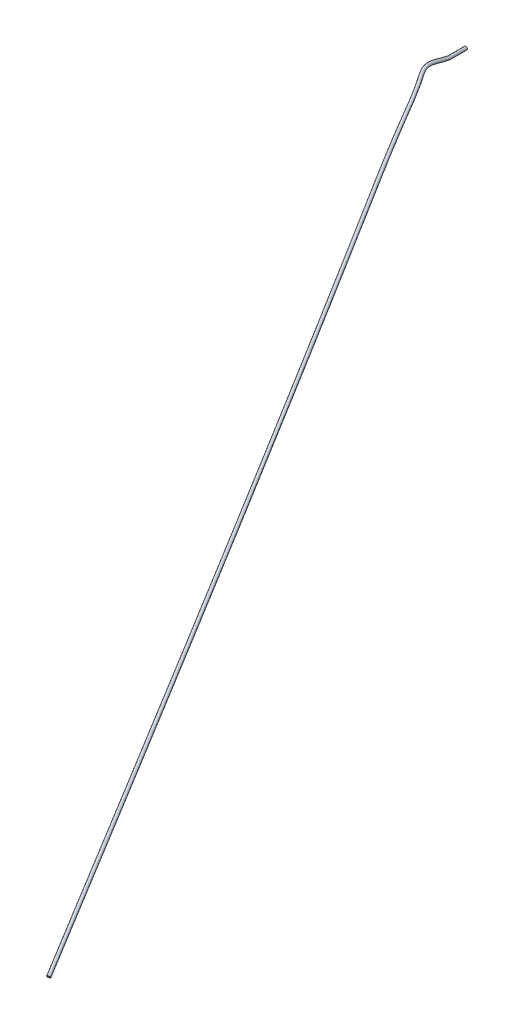
ISO-10303-21;
HEADER;
FILE_DESCRIPTION(('STEP AP214'),'2;1');
FILE_NAME('part.step','',(''),(''),'','','');
FILE_SCHEMA(('AUTOMOTIVE_DESIGN { 1 0 10303 214 1 1 1 1 }'));
ENDSEC;
DATA;
#1=APPLICATION_CONTEXT('core data for automotive mechanical design processes');
#2=APPLICATION_PROTOCOL_DEFINITION('international standard','automotive_design',2000,#1);
#3=PRODUCT_CONTEXT('',#1,'mechanical');
#4=PRODUCT('Part','Part','',(#3));
#5=PRODUCT_RELATED_PRODUCT_CATEGORY('part','',(#4));
#6=PRODUCT_DEFINITION_FORMATION('','',#4);
#7=PRODUCT_DEFINITION_CONTEXT('part definition',#1,'design');
#8=PRODUCT_DEFINITION('design','',#6,#7);
#9=PRODUCT_DEFINITION_SHAPE('','',#8);
#10=(LENGTH_UNIT() NAMED_UNIT(*) SI_UNIT(.MILLI.,.METRE.));
#11=(NAMED_UNIT(*) PLANE_ANGLE_UNIT() SI_UNIT($,.RADIAN.));
#12=(NAMED_UNIT(*) SI_UNIT($,.STERADIAN.) SOLID_ANGLE_UNIT());
#13=UNCERTAINTY_MEASURE_WITH_UNIT(LENGTH_MEASURE(1.E-05),#10,'distance_accuracy_value','');
#14=(GEOMETRIC_REPRESENTATION_CONTEXT(3) GLOBAL_UNCERTAINTY_ASSIGNED_CONTEXT((#13)) GLOBAL_UNIT_ASSIGNED_CONTEXT((#10,
#11,#12)) REPRESENTATION_CONTEXT('',''));
#15=CARTESIAN_POINT('',(0.,0.,0.));
#16=DIRECTION('',(0.,0.,1.));
#17=DIRECTION('',(1.,0.,0.));
#18=AXIS2_PLACEMENT_3D('',#15,#16,#17);
#19=CARTESIAN_POINT('',(236.710605485788,-352.252507170124,632.934798983279));
#20=DIRECTION('',(0.322690557369012,-0.480200528574051,0.815645913704028));
#21=DIRECTION('',(0.942648952073105,0.0853449315447556,-0.322690557368973));
#22=AXIS2_PLACEMENT_3D('',#19,#20,#21);
#23=PLANE('',#22);
#24=CARTESIAN_POINT('',(236.710605485788,-352.252507170124,632.934798983279));
#25=DIRECTION('',(0.322690557369012,-0.480200528574051,0.815645913704028));
#26=DIRECTION('',(0.942648952073105,0.0853449315447556,-0.322690557368973));
#27=AXIS2_PLACEMENT_3D('',#24,#25,#26);
#28=CIRCLE('',#27,0.79375);
#29=CARTESIAN_POINT('',(237.458833091496,-352.184764630711,632.678663353367));
#30=VERTEX_POINT('',#29);
#31=EDGE_CURVE('E86',#30,#30,#28,.T.);
#32=ORIENTED_EDGE('',*,*,#31,.F.);
#33=EDGE_LOOP('',(#32));
#34=FACE_BOUND('',#33,.T.);
#35=CARTESIAN_POINT('',(236.710605485788,-352.252507170124,632.934798983279));
#36=DIRECTION('',(0.322690557369012,-0.480200528574051,0.815645913704028));
#37=DIRECTION('',(0.942648952073105,0.0853449315447556,-0.322690557368973));
#38=AXIS2_PLACEMENT_3D('',#35,#36,#37);
#39=CIRCLE('',#38,1.5875);
#40=CARTESIAN_POINT('',(238.207060697204,-352.117022091297,632.422527723456));
#41=VERTEX_POINT('',#40);
#42=EDGE_CURVE('E76',#41,#41,#39,.T.);
#43=ORIENTED_EDGE('',*,*,#42,.T.);
#44=EDGE_LOOP('',(#43));
#45=FACE_BOUND('',#44,.T.);
#46=ADVANCED_FACE('F73',(#34,#45),#23,.T.);
#47=CARTESIAN_POINT('',(0.,0.,-16.002));
#48=DIRECTION('',(0.,0.,1.));
#49=DIRECTION('',(1.,0.,0.));
#50=AXIS2_PLACEMENT_3D('',#47,#48,#49);
#51=PLANE('',#50);
#52=CARTESIAN_POINT('',(0.,0.,-16.002));
#53=DIRECTION('',(0.,0.,1.));
#54=DIRECTION('',(1.,0.,0.));
#55=AXIS2_PLACEMENT_3D('',#52,#53,#54);
#56=CIRCLE('',#55,0.79375);
#57=CARTESIAN_POINT('',(0.793749999999997,0.,-16.002));
#58=VERTEX_POINT('',#57);
#59=EDGE_CURVE('E80',#58,#58,#56,.T.);
#60=ORIENTED_EDGE('',*,*,#59,.T.);
#61=EDGE_LOOP('',(#60));
#62=FACE_BOUND('',#61,.T.);
#63=CARTESIAN_POINT('',(0.,0.,-16.002));
#64=DIRECTION('',(0.,0.,1.));
#65=DIRECTION('',(1.,0.,0.));
#66=AXIS2_PLACEMENT_3D('',#63,#64,#65);
#67=CIRCLE('',#66,1.5875);
#68=CARTESIAN_POINT('',(1.5875,0.,-16.002));
#69=VERTEX_POINT('',#68);
#70=EDGE_CURVE('E11',#69,#69,#67,.T.);
#71=ORIENTED_EDGE('',*,*,#70,.F.);
#72=EDGE_LOOP('',(#71));
#73=FACE_BOUND('',#72,.T.);
#74=ADVANCED_FACE('F97',(#62,#73),#51,.F.);
#75=CARTESIAN_POINT('',(1.5875,0.,-16.002));
#76=CARTESIAN_POINT('',(1.56231812984331,0.0374735085473378,-12.8117191256881));
#77=CARTESIAN_POINT('',(1.51953913729642,0.101133551779921,-7.39206598255584));
#78=CARTESIAN_POINT('',(1.7526528527478,-0.245766370827986,0.762523901290285));
#79=CARTESIAN_POINT('',(0.7868840989971,1.19140820847362,8.16614427153038));
#80=CARTESIAN_POINT('',(-0.103520265767398,2.51643194046857,15.2297698194791));
#81=CARTESIAN_POINT('',(-0.198002301530254,2.6570320369944,20.0663155760043));
#82=CARTESIAN_POINT('',(0.30707598409501,1.90541766777946,23.4675066524053));
#83=CARTESIAN_POINT('',(1.27759821181992,0.4611693744728,26.4628435951212));
#84=CARTESIAN_POINT('',(2.39790059736375,-1.2059689579505,28.8211496680421));
#85=CARTESIAN_POINT('',(7.34937500872136,-8.57433030369576,39.7303726570623));
#86=CARTESIAN_POINT('',(12.1784478012152,-15.7605440137744,53.5722896940292));
#87=CARTESIAN_POINT('',(22.5705848640703,-31.225234865854,81.2106490986659));
#88=CARTESIAN_POINT('',(34.8543934038217,-49.5049496544887,111.68617938742));
#89=CARTESIAN_POINT('',(66.7963432599243,-97.038231476076,191.560996686692));
#90=CARTESIAN_POINT('',(135.043378662255,-198.597641026243,364.461788076484));
#91=CARTESIAN_POINT('',(196.941587883224,-290.709269665275,525.238231864667));
#92=CARTESIAN_POINT('',(238.207060697204,-352.117022091297,632.422527723456));
#93=CARTESIAN_POINT('',(1.5875,-3.175,-16.002));
#94=CARTESIAN_POINT('',(1.55382256036675,-3.1248841105091,-12.6842861334181));
#95=CARTESIAN_POINT('',(1.49661128375764,-3.03974717470284,-7.04814966348664));
#96=CARTESIAN_POINT('',(1.7159823889855,-3.36619651844317,1.32760001656434));
#97=CARTESIAN_POINT('',(0.749862311107635,-1.9284991285796,8.77027428200376));
#98=CARTESIAN_POINT('',(-0.124143175327823,-0.627878806791702,15.6511238676273));
#99=CARTESIAN_POINT('',(-0.157254558283172,-0.57860527450566,19.8417954405262));
#100=CARTESIAN_POINT('',(0.171161116927951,-1.06732543450726,22.4135510949093));
#101=CARTESIAN_POINT('',(0.969801414369941,-2.25579371848502,24.7837402976175));
#102=CARTESIAN_POINT('',(2.06475402003297,-3.88520867344959,27.1161572417102));
#103=CARTESIAN_POINT('',(6.96422987808324,-11.1761902130213,38.1151447714558));
#104=CARTESIAN_POINT('',(11.8393909503819,-18.4309885650052,52.022989555991));
#105=CARTESIAN_POINT('',(22.3523593910244,-34.0754903540856,79.7216622773144));
#106=CARTESIAN_POINT('',(34.6428438743869,-52.3651397118533,110.184794100101));
#107=CARTESIAN_POINT('',(66.4186820437248,-99.6512283077165,189.925176063826));
#108=CARTESIAN_POINT('',(134.844251297124,-201.476316687628,362.993776591847));
#109=CARTESIAN_POINT('',(196.699354842579,-293.523799141737,523.736245263879));
#110=CARTESIAN_POINT('',(237.93609053955,-354.888787444475,630.897891045233));
#111=CARTESIAN_POINT('',(-1.5875,-3.175,-16.002));
#112=CARTESIAN_POINT('',(-1.6154684912119,-3.13337967998552,-12.7699199902257));
#113=CARTESIAN_POINT('',(-1.66298139909588,-3.06267502824125,-7.27925842344221));
#114=CARTESIAN_POINT('',(-1.43437537993345,-3.40286698220501,0.947873806901065));
#115=CARTESIAN_POINT('',(-2.40025937106898,-1.96552091646891,8.36430419616919));
#116=CARTESIAN_POINT('',(-3.28528476038501,-0.648501716352828,15.3679776306784));
#117=CARTESIAN_POINT('',(-3.35963668553506,-0.537857531259143,19.9926710088499));
#118=CARTESIAN_POINT('',(-2.91250528048067,-1.20324030167485,23.1218000160432));
#119=CARTESIAN_POINT('',(-1.99836182845167,-2.56359051593552,25.9120830350994));
#120=CARTESIAN_POINT('',(-0.886374392312285,-4.21835525078089,28.2618972474462));
#121=CARTESIAN_POINT('',(4.04804403899785,-11.5613353436599,39.200563790531));
#122=CARTESIAN_POINT('',(8.89223419016368,-18.7700454158389,53.0641057050296));
#123=CARTESIAN_POINT('',(19.3240050012208,-34.293715827132,80.7222484047886));
#124=CARTESIAN_POINT('',(31.6100033088366,-52.5766892412887,111.19371188832));
#125=CARTESIAN_POINT('',(63.4974670795598,-100.028889523916,191.024433222321));
#126=CARTESIAN_POINT('',(131.803063145754,-201.67544405276,363.980267476412));
#127=CARTESIAN_POINT('',(193.687133328332,-293.766032182382,524.745567129493));
#128=CARTESIAN_POINT('',(234.943180116718,-355.15975760213,631.922433564879));
#129=CARTESIAN_POINT('',(-1.5875,0.,-16.002));
#130=CARTESIAN_POINT('',(-1.60697292173534,0.028977939070915,-12.8973529824957));
#131=CARTESIAN_POINT('',(-1.6400535455571,0.0782056982415111,-7.62317474251141));
#132=CARTESIAN_POINT('',(-1.39770491617115,-0.282436834589828,0.382797691627002));
#133=CARTESIAN_POINT('',(-2.36323758317951,1.15438642058431,7.76017418569581));
#134=CARTESIAN_POINT('',(-3.26466185082459,2.49580903090744,14.9466235825302));
#135=CARTESIAN_POINT('',(-3.40038442878214,2.69777978024092,20.2171911443281));
#136=CARTESIAN_POINT('',(-2.77659041331361,1.76950280061187,24.1757555735392));
#137=CARTESIAN_POINT('',(-1.69056503100169,0.153372577022304,27.5911863326032));
#138=CARTESIAN_POINT('',(-0.553227814981497,-1.53911553528179,29.9668896737781));
#139=CARTESIAN_POINT('',(4.43318916963597,-8.95947543433436,40.8157916761375));
#140=CARTESIAN_POINT('',(9.23129104099691,-16.0996008646081,54.6134058430677));
#141=CARTESIAN_POINT('',(19.5422304742666,-31.4434603389004,82.2112352261401));
#142=CARTESIAN_POINT('',(31.8215528382715,-49.7164991839241,112.69509717564));
#143=CARTESIAN_POINT('',(63.8751282957593,-97.415892692276,192.660253845187));
#144=CARTESIAN_POINT('',(132.002190510885,-198.796768391374,365.448278961049));
#145=CARTESIAN_POINT('',(193.929366368977,-290.951502705921,526.247553730281));
#146=CARTESIAN_POINT('',(235.214150274372,-352.387992248952,633.447070243102));
#147=CARTESIAN_POINT('',(-1.5875,3.175,-16.002));
#148=CARTESIAN_POINT('',(-1.59847735225877,3.19133555812735,-13.0247859747657));
#149=CARTESIAN_POINT('',(-1.61712569201831,3.21908642472428,-7.96709106158061));
#150=CARTESIAN_POINT('',(-1.36103445240885,2.83799331302535,-0.182278423647054));
#151=CARTESIAN_POINT('',(-2.32621579529005,4.27429375763753,7.15604417522242));
#152=CARTESIAN_POINT('',(-3.24403894126416,5.64011977816771,14.525269534382));
#153=CARTESIAN_POINT('',(-3.44113217202922,5.93341709174099,20.4417112798062));
#154=CARTESIAN_POINT('',(-2.64067554614655,4.74224590289858,25.2297111310353));
#155=CARTESIAN_POINT('',(-1.38276823355171,2.87033566998012,29.270289630107));
#156=CARTESIAN_POINT('',(-0.220081237650709,1.1401241802173,31.6718821001099));
#157=CARTESIAN_POINT('',(4.81833430027409,-6.35761552500886,42.4310195617441));
#158=CARTESIAN_POINT('',(9.57034789183013,-13.4291563133773,56.1627059811059));
#159=CARTESIAN_POINT('',(19.7604559473125,-28.5932048506688,83.7002220474917));
#160=CARTESIAN_POINT('',(32.0331023677063,-46.8563091265595,114.196482462959));
#161=CARTESIAN_POINT('',(64.2527895119588,-94.8028958606354,194.296074468053));
#162=CARTESIAN_POINT('',(132.201317876016,-195.918092729989,366.916290445686));
#163=CARTESIAN_POINT('',(194.171599409622,-288.13697322946,527.74954033107));
#164=CARTESIAN_POINT('',(235.485120432026,-349.616226895774,634.971706921325));
#165=CARTESIAN_POINT('',(1.5875,3.175,-16.002));
#166=CARTESIAN_POINT('',(1.57081369931987,3.19983112760378,-12.9391521179581));
#167=CARTESIAN_POINT('',(1.54246699083521,3.24201427826269,-7.73598230162504));
#168=CARTESIAN_POINT('',(1.7893233165101,2.8746637767872,0.19744778601622));
#169=CARTESIAN_POINT('',(0.823905886886564,4.31131554552684,7.56201426105699));
#170=CARTESIAN_POINT('',(-0.0828973562069718,5.66074268772884,14.8084157713308));
#171=CARTESIAN_POINT('',(-0.238750044777338,5.89266934849447,20.2908357114824));
#172=CARTESIAN_POINT('',(0.442990851262068,4.87816077006617,24.5214622099014));
#173=CARTESIAN_POINT('',(1.5853950092699,3.17813246743062,28.141946892625));
#174=CARTESIAN_POINT('',(2.73104717469454,1.4732707575486,30.5261420943739));
#175=CARTESIAN_POINT('',(7.73452013935949,-5.97247039437026,41.3456005426689));
#176=CARTESIAN_POINT('',(12.5175046520484,-13.0900994625436,55.1215898320673));
#177=CARTESIAN_POINT('',(22.7888103371161,-28.3749793776224,82.6996359200175));
#178=CARTESIAN_POINT('',(35.0659429332566,-46.6447595971241,113.18756467474));
#179=CARTESIAN_POINT('',(67.1740044761238,-94.4252346444354,193.196817309558));
#180=CARTESIAN_POINT('',(135.242506027386,-195.718965364857,365.929799561121));
#181=CARTESIAN_POINT('',(197.183820923869,-287.894740188814,526.740218465456));
#182=CARTESIAN_POINT('',(238.478030854858,-349.345256738119,633.947164401678));
#183=CARTESIAN_POINT('',(1.5875,0.,-16.002));
#184=CARTESIAN_POINT('',(1.56231812984331,0.0374735085473378,-12.8117191256881));
#185=CARTESIAN_POINT('',(1.51953913729642,0.101133551779921,-7.39206598255584));
#186=CARTESIAN_POINT('',(1.7526528527478,-0.245766370827986,0.762523901290285));
#187=CARTESIAN_POINT('',(0.7868840989971,1.19140820847362,8.16614427153038));
#188=CARTESIAN_POINT('',(-0.103520265767398,2.51643194046857,15.2297698194791));
#189=CARTESIAN_POINT('',(-0.198002301530254,2.6570320369944,20.0663155760043));
#190=CARTESIAN_POINT('',(0.30707598409501,1.90541766777946,23.4675066524053));
#191=CARTESIAN_POINT('',(1.27759821181992,0.4611693744728,26.4628435951212));
#192=CARTESIAN_POINT('',(2.39790059736375,-1.2059689579505,28.8211496680421));
#193=CARTESIAN_POINT('',(7.34937500872136,-8.57433030369576,39.7303726570623));
#194=CARTESIAN_POINT('',(12.1784478012152,-15.7605440137744,53.5722896940292));
#195=CARTESIAN_POINT('',(22.5705848640703,-31.225234865854,81.2106490986659));
#196=CARTESIAN_POINT('',(34.8543934038217,-49.5049496544887,111.68617938742));
#197=CARTESIAN_POINT('',(66.7963432599243,-97.038231476076,191.560996686692));
#198=CARTESIAN_POINT('',(135.043378662255,-198.597641026243,364.461788076484));
#199=CARTESIAN_POINT('',(196.941587883224,-290.709269665275,525.238231864667));
#200=CARTESIAN_POINT('',(238.207060697204,-352.117022091297,632.422527723456));
#201=(BOUNDED_SURFACE() B_SPLINE_SURFACE(3,3,((#75,#76,#77,#78,#79,#80,#81,#82,#83,#84,#85,#86,
#87,#88,#89,#90,#91,#92),(#93,#94,#95,#96,#97,#98,#99,#100,#101,#102,#103,#104,#105,#106,#107,
#108,#109,#110),(#111,#112,#113,#114,#115,#116,#117,#118,#119,#120,#121,#122,#123,#124,#125,
#126,#127,#128),(#129,#130,#131,#132,#133,#134,#135,#136,#137,#138,#139,#140,#141,#142,#143,
#144,#145,#146),(#147,#148,#149,#150,#151,#152,#153,#154,#155,#156,#157,#158,#159,#160,#161,
#162,#163,#164),(#165,#166,#167,#168,#169,#170,#171,#172,#173,#174,#175,#176,#177,#178,#179,
#180,#181,#182),(#183,#184,#185,#186,#187,#188,#189,#190,#191,#192,#193,#194,#195,#196,#197,
#198,#199,#200)),.UNSPECIFIED.,.T.,.F.,.F.) B_SPLINE_SURFACE_WITH_KNOTS((4,3,4),(4,1,1,1,1,1,1,
1,1,1,1,1,1,1,1,4),(0.,0.5,1.),(0.,0.012022774989448,0.0204243052031551,0.03125,
0.0390624999999997,0.046875,0.0510663754273736,0.0546875,0.0614545466169199,0.0624999999999995,
0.10684189151282,0.125000000000001,0.190814222987827,0.25,0.5,1.),
.UNSPECIFIED.) GEOMETRIC_REPRESENTATION_ITEM() RATIONAL_B_SPLINE_SURFACE(((1.,1.,1.,1.,1.,1.,1.,
1.,1.,1.,1.,0.999999999999999,1.,1.,1.,1.,1.,1.),(0.333333333333333,0.333333333333333,
0.333333333333333,0.333333333333333,0.333333333333333,0.333333333333333,0.333333333333333,
0.333333333333333,0.333333333333333,0.333333333333333,0.333333333333333,0.333333333333333,
0.333333333333333,0.333333333333333,0.333333333333333,0.333333333333334,0.333333333333333,
0.333333333333333),(0.333333333333333,0.333333333333333,0.333333333333333,0.333333333333333,
0.333333333333333,0.333333333333333,0.333333333333333,0.333333333333333,0.333333333333333,
0.333333333333333,0.333333333333333,0.333333333333333,0.333333333333333,0.333333333333333,
0.333333333333333,0.333333333333334,0.333333333333333,0.333333333333333),(1.,1.,1.,1.,1.,1.,1.,
1.,1.,1.,1.,0.999999999999999,1.,1.,1.,1.,1.,1.),(0.333333333333333,0.333333333333333,
0.333333333333333,0.333333333333333,0.333333333333333,0.333333333333333,0.333333333333333,
0.333333333333333,0.333333333333333,0.333333333333333,0.333333333333333,0.333333333333333,
0.333333333333333,0.333333333333333,0.333333333333333,0.333333333333334,0.333333333333333,
0.333333333333333),(0.333333333333333,0.333333333333333,0.333333333333333,0.333333333333333,
0.333333333333333,0.333333333333333,0.333333333333333,0.333333333333333,0.333333333333333,
0.333333333333333,0.333333333333333,0.333333333333333,0.333333333333333,0.333333333333333,
0.333333333333333,0.333333333333334,0.333333333333333,0.333333333333333),(1.,1.,1.,1.,1.,1.,1.,
1.,1.,1.,1.,0.999999999999999,1.,1.,1.,1.,1.,1.))) REPRESENTATION_ITEM('') SURFACE());
#202=ORIENTED_EDGE('',*,*,#70,.T.);
#203=EDGE_LOOP('',(#202));
#204=FACE_BOUND('',#203,.T.);
#205=ORIENTED_EDGE('',*,*,#42,.F.);
#206=EDGE_LOOP('',(#205));
#207=FACE_BOUND('',#206,.T.);
#208=ADVANCED_FACE('F94',(#204,#207),#201,.F.);
#209=CARTESIAN_POINT('',(0.793749999999997,0.,-16.002));
#210=CARTESIAN_POINT('',(0.769995366948646,0.0353496161782322,-12.83312758989));
#211=CARTESIAN_POINT('',(0.729640966583044,0.0954015883953193,-7.44984317254474));
#212=CARTESIAN_POINT('',(0.965063410518063,-0.254933986768446,0.667592348874462));
#213=CARTESIAN_POINT('',(-0.000646321547053286,1.18215276150129,8.06465175007173));
#214=CARTESIAN_POINT('',(-0.893805662031695,2.51127621307829,15.1589832602418));
#215=CARTESIAN_POINT('',(-0.998597833343226,2.66721897280604,20.1040344680852));
#216=CARTESIAN_POINT('',(-0.463840615257145,1.87143895098756,23.6445688826888));
#217=CARTESIAN_POINT('',(0.535557401114519,0.384220175110175,26.7449292794917));
#218=CARTESIAN_POINT('',(1.66011849427744,-1.28925560228332,29.1075846694761));
#219=CARTESIAN_POINT('',(6.62032854895002,-8.67061658635541,40.0017274118311));
#220=CARTESIAN_POINT('',(11.4416586111606,-15.8453082264828,53.8325687312888));
#221=CARTESIAN_POINT('',(21.8134962666193,-31.2797912341156,81.4607956305345));
#222=CARTESIAN_POINT('',(34.0961832624342,-49.5578370368476,111.938408834475));
#223=CARTESIAN_POINT('',(66.0660395188831,-97.132646780126,191.835810976316));
#224=CARTESIAN_POINT('',(134.283081624412,-198.647422867526,364.708410797625));
#225=CARTESIAN_POINT('',(196.188532504662,-290.769827925437,525.490562331071));
#226=CARTESIAN_POINT('',(237.458833091496,-352.184764630711,632.678663353367));
#227=CARTESIAN_POINT('',(0.793749999999997,-1.5875,-16.002));
#228=CARTESIAN_POINT('',(0.765747582210365,-1.54582919334999,-12.769411093755));
#229=CARTESIAN_POINT('',(0.718177039813651,-1.47503877484606,-7.27788501301013));
#230=CARTESIAN_POINT('',(0.946728178636911,-1.81514906057604,0.950130406511493));
#231=CARTESIAN_POINT('',(-0.0191572154917855,-0.377800907025315,8.36671675530843));
#232=CARTESIAN_POINT('',(-0.904117116811908,0.939120839448152,15.369660284316));
#233=CARTESIAN_POINT('',(-0.978223961719685,1.049400317056,19.9917744003462));
#234=CARTESIAN_POINT('',(-0.531798048840674,0.3850673998442,23.1175911039408));
#235=CARTESIAN_POINT('',(0.381659002389529,-0.974261371368734,25.9053776307398));
#236=CARTESIAN_POINT('',(1.49354520561205,-2.62887546003287,28.2550884563101));
#237=CARTESIAN_POINT('',(6.42775598363095,-9.97154654101816,39.1941134690279));
#238=CARTESIAN_POINT('',(11.272130185744,-17.1805305020982,53.0579186622697));
#239=CARTESIAN_POINT('',(21.7043835300964,-32.7049189782314,80.7163022198587));
#240=CARTESIAN_POINT('',(33.9904084977168,-50.9879320655299,111.187716190815));
#241=CARTESIAN_POINT('',(65.8772089107833,-98.4391451959462,191.017900664883));
#242=CARTESIAN_POINT('',(134.183517941847,-200.086760698218,363.974405055307));
#243=CARTESIAN_POINT('',(196.06741598434,-292.177092663667,524.739569030677));
#244=CARTESIAN_POINT('',(237.323348012669,-353.5706473073,631.916345014256));
#245=CARTESIAN_POINT('',(-0.793750000000004,-1.5875,-16.002));
#246=CARTESIAN_POINT('',(-0.818897943578957,-1.5500769780882,-12.8122280221588));
#247=CARTESIAN_POINT('',(-0.861619301613111,-1.48650270161527,-7.39343939298792));
#248=CARTESIAN_POINT('',(-0.628450705822564,-1.83348429245696,0.760267301679856));
#249=CARTESIAN_POINT('',(-1.59421805658009,-0.39631180096997,8.16373171239114));
#250=CARTESIAN_POINT('',(-2.4846879093405,0.928809384667589,15.2280871658415));
#251=CARTESIAN_POINT('',(-2.57941502534563,1.06977418867926,20.0672121845081));
#252=CARTESIAN_POINT('',(-2.07363124754498,0.317109966260406,23.4717155645078));
#253=CARTESIAN_POINT('',(-1.10242261902128,-1.12815977009398,26.4695489994808));
#254=CARTESIAN_POINT('',(0.0179809994394215,-2.79544874869852,28.8279584591781));
#255=CARTESIAN_POINT('',(4.96966306408826,-10.1641191063375,39.7368229785655));
#256=CARTESIAN_POINT('',(9.79855180563486,-17.3500589275151,53.578476736789));
#257=CARTESIAN_POINT('',(20.1902063351946,-32.8140317147546,81.2165952835958));
#258=CARTESIAN_POINT('',(32.4739882149416,-51.0937068302475,111.692175084925));
#259=CARTESIAN_POINT('',(64.4166014287008,-98.6279758040463,191.56752924413));
#260=CARTESIAN_POINT('',(132.662923866162,-200.186324380784,364.467650497589));
#261=CARTESIAN_POINT('',(194.561305227216,-292.29820918399,525.244229963484));
#262=CARTESIAN_POINT('',(235.826892801253,-353.706132386127,632.428616274079));
#263=CARTESIAN_POINT('',(-0.793750000000003,0.,-16.002));
#264=CARTESIAN_POINT('',(-0.814650158840676,0.0311018314400206,-12.8759445182938));
#265=CARTESIAN_POINT('',(-0.850155374843717,0.0839376616261137,-7.56539755252252));
#266=CARTESIAN_POINT('',(-0.610115473941412,-0.273269218649368,0.477729244042821));
#267=CARTESIAN_POINT('',(-1.57570716263536,1.16364186755664,7.86166670715445));
#268=CARTESIAN_POINT('',(-2.47437645456029,2.50096475829773,15.0174101417674));
#269=CARTESIAN_POINT('',(-2.59978889696917,2.68759284442929,20.1794722522471));
#270=CARTESIAN_POINT('',(-2.00567381396145,1.80348151740376,23.9986933432558));
#271=CARTESIAN_POINT('',(-0.948524220296285,0.230321776384927,27.3091006482327));
#272=CARTESIAN_POINT('',(0.184554288104816,-1.45582889094897,29.6804546723441));
#273=CARTESIAN_POINT('',(5.16223562940732,-8.86318915167471,40.5444369213687));
#274=CARTESIAN_POINT('',(9.96808023105147,-16.0148366518997,54.3531268058081));
#275=CARTESIAN_POINT('',(20.2993190717175,-31.3889039706388,81.9610886942716));
#276=CARTESIAN_POINT('',(32.579762979659,-49.6636118015652,112.442867728585));
#277=CARTESIAN_POINT('',(64.6054320368006,-97.321477388226,192.385439555563));
#278=CARTESIAN_POINT('',(132.762487548727,-198.746986550091,365.201656239908));
#279=CARTESIAN_POINT('',(194.682421747539,-290.890944445759,525.995223263878));
#280=CARTESIAN_POINT('',(235.96237788008,-352.320249709538,633.190934613191));
#281=CARTESIAN_POINT('',(-0.793750000000003,1.5875,-16.002));
#282=CARTESIAN_POINT('',(-0.810402374102395,1.61228064096824,-12.9396610144288));
#283=CARTESIAN_POINT('',(-0.838691448074325,1.6543780248675,-7.73735571205712));
#284=CARTESIAN_POINT('',(-0.591780242060261,1.28694585515822,0.195191186405792));
#285=CARTESIAN_POINT('',(-1.55719626869063,2.72359553608325,7.55960170191775));
#286=CARTESIAN_POINT('',(-2.46406499978008,4.07312013192786,14.8067331176933));
#287=CARTESIAN_POINT('',(-2.62016276859271,4.30541150017933,20.2917323199862));
#288=CARTESIAN_POINT('',(-1.93771638037792,3.28985306854712,24.5256711220038));
#289=CARTESIAN_POINT('',(-0.794625821571295,1.58880332286384,28.1486522969846));
#290=CARTESIAN_POINT('',(0.351127576770209,-0.116209033199423,30.53295088551));
#291=CARTESIAN_POINT('',(5.35480819472638,-7.56225919701197,41.352050864172));
#292=CARTESIAN_POINT('',(10.1376086564681,-14.6796143762843,55.1277768748271));
#293=CARTESIAN_POINT('',(20.4084318082404,-29.963776226523,82.7055821049474));
#294=CARTESIAN_POINT('',(32.6855377443764,-48.2335167728829,113.193560372244));
#295=CARTESIAN_POINT('',(64.7942626449003,-96.0149789724057,193.203349866996));
#296=CARTESIAN_POINT('',(132.862051231293,-197.307648719399,365.935661982227));
#297=CARTESIAN_POINT('',(194.803538267861,-289.483679707529,526.746216564272));
#298=CARTESIAN_POINT('',(236.097862958907,-350.934367032949,633.953252952302));
#299=CARTESIAN_POINT('',(0.793749999999997,1.5875,-16.002));
#300=CARTESIAN_POINT('',(0.774243151686927,1.61652842570645,-12.896844086025));
#301=CARTESIAN_POINT('',(0.741104893352437,1.6658419516367,-7.62180133207934));
#302=CARTESIAN_POINT('',(0.983398642399214,1.30528108703914,0.385054291237432));
#303=CARTESIAN_POINT('',(0.0178645723976788,2.7421064300279,7.76258674483504));
#304=CARTESIAN_POINT('',(-0.883494207251482,4.08343158670842,14.9483062361677));
#305=CARTESIAN_POINT('',(-1.01897170496677,4.28503762855607,20.2162945358243));
#306=CARTESIAN_POINT('',(-0.395883181673616,3.35781050213092,24.1715466614368));
#307=CARTESIAN_POINT('',(0.68945579983951,1.74270172158909,27.5844809282436));
#308=CARTESIAN_POINT('',(1.82669178294283,0.0503642554662243,29.960080882642));
#309=CARTESIAN_POINT('',(6.81290111426908,-7.36968663169266,40.8093413546344));
#310=CARTESIAN_POINT('',(11.6111870365772,-14.5100859508674,54.6072188003078));
#311=CARTESIAN_POINT('',(21.9226090031423,-29.8546634899998,82.2052890412103));
#312=CARTESIAN_POINT('',(34.2019580271516,-48.1277420081653,112.689101478135));
#313=CARTESIAN_POINT('',(66.2548701269828,-95.8261483643057,192.653721287748));
#314=CARTESIAN_POINT('',(134.382645306978,-197.208085036833,365.442416539944));
#315=CARTESIAN_POINT('',(196.309649024985,-289.362563187206,526.241555631465));
#316=CARTESIAN_POINT('',(237.594318170323,-350.798881954122,633.440981692479));
#317=CARTESIAN_POINT('',(0.793749999999997,0.,-16.002));
#318=CARTESIAN_POINT('',(0.769995366948646,0.0353496161782322,-12.83312758989));
#319=CARTESIAN_POINT('',(0.729640966583044,0.0954015883953193,-7.44984317254474));
#320=CARTESIAN_POINT('',(0.965063410518063,-0.254933986768446,0.667592348874462));
#321=CARTESIAN_POINT('',(-0.000646321547053286,1.18215276150129,8.06465175007173));
#322=CARTESIAN_POINT('',(-0.893805662031695,2.51127621307829,15.1589832602418));
#323=CARTESIAN_POINT('',(-0.998597833343226,2.66721897280604,20.1040344680852));
#324=CARTESIAN_POINT('',(-0.463840615257145,1.87143895098756,23.6445688826888));
#325=CARTESIAN_POINT('',(0.535557401114519,0.384220175110175,26.7449292794917));
#326=CARTESIAN_POINT('',(1.66011849427744,-1.28925560228332,29.1075846694761));
#327=CARTESIAN_POINT('',(6.62032854895002,-8.67061658635541,40.0017274118311));
#328=CARTESIAN_POINT('',(11.4416586111606,-15.8453082264828,53.8325687312888));
#329=CARTESIAN_POINT('',(21.8134962666193,-31.2797912341156,81.4607956305345));
#330=CARTESIAN_POINT('',(34.0961832624342,-49.5578370368476,111.938408834475));
#331=CARTESIAN_POINT('',(66.0660395188831,-97.132646780126,191.835810976316));
#332=CARTESIAN_POINT('',(134.283081624412,-198.647422867526,364.708410797625));
#333=CARTESIAN_POINT('',(196.188532504662,-290.769827925437,525.490562331071));
#334=CARTESIAN_POINT('',(237.458833091496,-352.184764630711,632.678663353367));
#335=(BOUNDED_SURFACE() B_SPLINE_SURFACE(3,3,((#209,#210,#211,#212,#213,#214,#215,#216,#217,
#218,#219,#220,#221,#222,#223,#224,#225,#226),(#227,#228,#229,#230,#231,#232,#233,#234,#235,
#236,#237,#238,#239,#240,#241,#242,#243,#244),(#245,#246,#247,#248,#249,#250,#251,#252,#253,
#254,#255,#256,#257,#258,#259,#260,#261,#262),(#263,#264,#265,#266,#267,#268,#269,#270,#271,
#272,#273,#274,#275,#276,#277,#278,#279,#280),(#281,#282,#283,#284,#285,#286,#287,#288,#289,
#290,#291,#292,#293,#294,#295,#296,#297,#298),(#299,#300,#301,#302,#303,#304,#305,#306,#307,
#308,#309,#310,#311,#312,#313,#314,#315,#316),(#317,#318,#319,#320,#321,#322,#323,#324,#325,
#326,#327,#328,#329,#330,#331,#332,#333,#334)),.UNSPECIFIED.,.T.,.F.,
.F.) B_SPLINE_SURFACE_WITH_KNOTS((4,3,4),(4,1,1,1,1,1,1,1,1,1,1,1,1,1,1,4),(0.,0.5,1.),(0.,
0.012022774989448,0.0204243052031551,0.03125,0.0390624999999997,0.046875,0.0510663754273736,
0.0546875,0.0614545466169199,0.0624999999999995,0.10684189151282,0.125000000000001,
0.190814222987827,0.25,0.5,1.),
.UNSPECIFIED.) GEOMETRIC_REPRESENTATION_ITEM() RATIONAL_B_SPLINE_SURFACE(((1.,1.,1.,1.,1.,1.,1.,
1.,1.,1.,1.,0.999999999999999,1.,1.,1.,1.,1.,1.),(0.333333333333333,0.333333333333333,
0.333333333333333,0.333333333333333,0.333333333333333,0.333333333333333,0.333333333333333,
0.333333333333333,0.333333333333333,0.333333333333333,0.333333333333333,0.333333333333333,
0.333333333333333,0.333333333333333,0.333333333333333,0.333333333333334,0.333333333333333,
0.333333333333333),(0.333333333333333,0.333333333333333,0.333333333333333,0.333333333333333,
0.333333333333333,0.333333333333333,0.333333333333333,0.333333333333333,0.333333333333333,
0.333333333333333,0.333333333333333,0.333333333333333,0.333333333333333,0.333333333333333,
0.333333333333333,0.333333333333334,0.333333333333333,0.333333333333333),(1.,1.,1.,1.,1.,1.,1.,
1.,1.,1.,1.,0.999999999999999,1.,1.,1.,1.,1.,1.),(0.333333333333333,0.333333333333333,
0.333333333333333,0.333333333333333,0.333333333333333,0.333333333333333,0.333333333333333,
0.333333333333333,0.333333333333333,0.333333333333333,0.333333333333333,0.333333333333333,
0.333333333333333,0.333333333333333,0.333333333333333,0.333333333333334,0.333333333333333,
0.333333333333333),(0.333333333333333,0.333333333333333,0.333333333333333,0.333333333333333,
0.333333333333333,0.333333333333333,0.333333333333333,0.333333333333333,0.333333333333333,
0.333333333333333,0.333333333333333,0.333333333333333,0.333333333333333,0.333333333333333,
0.333333333333333,0.333333333333334,0.333333333333333,0.333333333333333),(1.,1.,1.,1.,1.,1.,1.,
1.,1.,1.,1.,0.999999999999999,1.,1.,1.,1.,1.,1.))) REPRESENTATION_ITEM('') SURFACE());
#336=ORIENTED_EDGE('',*,*,#59,.F.);
#337=EDGE_LOOP('',(#336));
#338=FACE_BOUND('',#337,.T.);
#339=ORIENTED_EDGE('',*,*,#31,.T.);
#340=EDGE_LOOP('',(#339));
#341=FACE_BOUND('',#340,.T.);
#342=ADVANCED_FACE('F96',(#338,#341),#335,.T.);
#343=CLOSED_SHELL('',(#46,#74,#208,#342));
#344=MANIFOLD_SOLID_BREP('B2',#343);
#345=ADVANCED_BREP_SHAPE_REPRESENTATION('',(#18,#344),#14);
#346=SHAPE_DEFINITION_REPRESENTATION(#9,#345);
ENDSEC;
END-ISO-10303-21;
